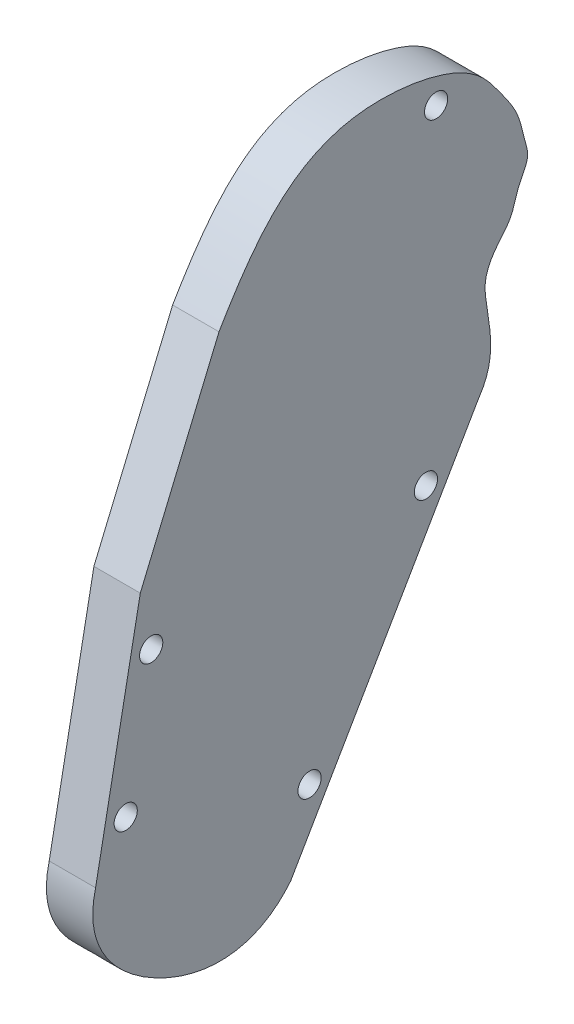
ISO-10303-21;
HEADER;
FILE_DESCRIPTION(('STEP AP214'),'2;1');
FILE_NAME('part.step','',(''),(''),'','','');
FILE_SCHEMA(('AUTOMOTIVE_DESIGN { 1 0 10303 214 1 1 1 1 }'));
ENDSEC;
DATA;
#1=APPLICATION_CONTEXT('core data for automotive mechanical design processes');
#2=APPLICATION_PROTOCOL_DEFINITION('international standard','automotive_design',2000,#1);
#3=PRODUCT_CONTEXT('',#1,'mechanical');
#4=PRODUCT('Part','Part','',(#3));
#5=PRODUCT_RELATED_PRODUCT_CATEGORY('part','',(#4));
#6=PRODUCT_DEFINITION_FORMATION('','',#4);
#7=PRODUCT_DEFINITION_CONTEXT('part definition',#1,'design');
#8=PRODUCT_DEFINITION('design','',#6,#7);
#9=PRODUCT_DEFINITION_SHAPE('','',#8);
#10=(LENGTH_UNIT() NAMED_UNIT(*) SI_UNIT(.MILLI.,.METRE.));
#11=(NAMED_UNIT(*) PLANE_ANGLE_UNIT() SI_UNIT($,.RADIAN.));
#12=(NAMED_UNIT(*) SI_UNIT($,.STERADIAN.) SOLID_ANGLE_UNIT());
#13=UNCERTAINTY_MEASURE_WITH_UNIT(LENGTH_MEASURE(1.E-05),#10,'distance_accuracy_value','');
#14=(GEOMETRIC_REPRESENTATION_CONTEXT(3) GLOBAL_UNCERTAINTY_ASSIGNED_CONTEXT((#13)) GLOBAL_UNIT_ASSIGNED_CONTEXT((#10,
#11,#12)) REPRESENTATION_CONTEXT('',''));
#15=CARTESIAN_POINT('',(0.,0.,0.));
#16=DIRECTION('',(0.,0.,1.));
#17=DIRECTION('',(1.,0.,0.));
#18=AXIS2_PLACEMENT_3D('',#15,#16,#17);
#19=CARTESIAN_POINT('',(-5.,3.24268600938084,-18.5764900303567));
#20=CARTESIAN_POINT('',(-5.,5.87147233760619,-20.3998753405111));
#21=CARTESIAN_POINT('',(-5.,9.3921691085198,-19.6866785835696));
#22=CARTESIAN_POINT('',(-5.,13.8192568790985,-19.0567329112693));
#23=CARTESIAN_POINT('',(-5.,16.2846985090689,-20.2071283244041));
#24=CARTESIAN_POINT('',(-5.,18.154123407449,-22.236157968365));
#25=CARTESIAN_POINT('',(-5.,20.9000774768321,-22.6647365482831));
#26=CARTESIAN_POINT('',(-5.,22.8746123278666,-24.1423851355693));
#27=CARTESIAN_POINT('',(-5.,25.1104176667717,-23.3711660386291));
#28=CARTESIAN_POINT('',(-5.,27.7566189817592,-22.923217745328));
#29=CARTESIAN_POINT('',(-5.,30.3603766268074,-21.0204509876353));
#30=CARTESIAN_POINT('',(-5.,33.0146527615162,-19.1114742427048));
#31=CARTESIAN_POINT('',(-5.,34.5537711996612,-16.8206103843109));
#32=CARTESIAN_POINT('',(-5.,35.7835159213308,-13.5726265314443));
#33=CARTESIAN_POINT('',(-5.,36.5144876853185,-9.24139966209001));
#34=CARTESIAN_POINT('',(-5.,36.2299152608115,-4.11269981578682));
#35=CARTESIAN_POINT('',(-5.,33.0862653845341,3.47885982254407));
#36=CARTESIAN_POINT('',(-5.,27.3181439560148,7.11739920299947));
#37=CARTESIAN_POINT('',(-5.,23.3959085428148,9.43898597361147));
#38=B_SPLINE_CURVE_WITH_KNOTS('',3,(#19,#20,#21,#22,#23,#24,#25,#26,#27,#28,#29,#30,#31,#32,#33,
#34,#35,#36,#37),.UNSPECIFIED.,.F.,.F.,(4,1,1,1,1,1,1,1,1,1,1,1,1,1,1,1,4),(0.,
0.124663564460705,0.161437725204497,0.195659694225229,0.24195670233481,0.280314530276236,
0.317452049066172,0.342380682780381,0.380427051216662,0.438288460536179,0.482854303333472,
0.526779389798994,0.55920608913252,0.638222424046053,0.72183705193685,0.785951737587909,1.),.UNSPECIFIED.);
#39=DIRECTION('',(1.,0.,0.));
#40=VECTOR('',#39,1.);
#41=SURFACE_OF_LINEAR_EXTRUSION('',#38,#40);
#42=CARTESIAN_POINT('',(0.,3.24268600938084,-18.5764900303567));
#43=CARTESIAN_POINT('',(0.,5.87147233760619,-20.3998753405111));
#44=CARTESIAN_POINT('',(0.,9.3921691085198,-19.6866785835696));
#45=CARTESIAN_POINT('',(0.,13.8192568790985,-19.0567329112693));
#46=CARTESIAN_POINT('',(0.,16.2846985090689,-20.2071283244041));
#47=CARTESIAN_POINT('',(0.,18.154123407449,-22.236157968365));
#48=CARTESIAN_POINT('',(0.,20.9000774768321,-22.6647365482831));
#49=CARTESIAN_POINT('',(0.,22.8746123278666,-24.1423851355693));
#50=CARTESIAN_POINT('',(0.,25.1104176667717,-23.3711660386291));
#51=CARTESIAN_POINT('',(0.,27.7566189817592,-22.923217745328));
#52=CARTESIAN_POINT('',(0.,30.3603766268074,-21.0204509876353));
#53=CARTESIAN_POINT('',(0.,33.0146527615162,-19.1114742427048));
#54=CARTESIAN_POINT('',(0.,34.5537711996612,-16.8206103843109));
#55=CARTESIAN_POINT('',(0.,35.7835159213308,-13.5726265314443));
#56=CARTESIAN_POINT('',(0.,36.5144876853185,-9.24139966209001));
#57=CARTESIAN_POINT('',(0.,36.2299152608115,-4.11269981578682));
#58=CARTESIAN_POINT('',(0.,33.0862653845341,3.47885982254407));
#59=CARTESIAN_POINT('',(0.,27.3181439560148,7.11739920299947));
#60=CARTESIAN_POINT('',(0.,23.3959085428148,9.43898597361147));
#61=B_SPLINE_CURVE_WITH_KNOTS('',3,(#42,#43,#44,#45,#46,#47,#48,#49,#50,#51,#52,#53,#54,#55,#56,
#57,#58,#59,#60),.UNSPECIFIED.,.F.,.F.,(4,1,1,1,1,1,1,1,1,1,1,1,1,1,1,1,4),(0.,
0.124663564460705,0.161437725204497,0.195659694225229,0.24195670233481,0.280314530276236,
0.317452049066172,0.342380682780381,0.380427051216662,0.438288460536179,0.482854303333472,
0.526779389798994,0.55920608913252,0.638222424046053,0.72183705193685,0.785951737587909,1.),.UNSPECIFIED.);
#62=CARTESIAN_POINT('',(0.,3.24268600938084,-18.5764900303567));
#63=VERTEX_POINT('',#62);
#64=CARTESIAN_POINT('',(0.,23.3959085428148,9.43898597361147));
#65=VERTEX_POINT('',#64);
#66=EDGE_CURVE('E148',#63,#65,#61,.T.);
#67=ORIENTED_EDGE('',*,*,#66,.F.);
#68=DIRECTION('',(1.,0.,0.));
#69=VECTOR('',#68,1.);
#70=CARTESIAN_POINT('',(-5.,3.24268600938084,-18.5764900303567));
#71=LINE('',#70,#69);
#72=CARTESIAN_POINT('',(-5.,3.24268600938084,-18.5764900303567));
#73=VERTEX_POINT('',#72);
#74=EDGE_CURVE('E11',#73,#63,#71,.T.);
#75=ORIENTED_EDGE('',*,*,#74,.F.);
#76=CARTESIAN_POINT('',(-5.,23.3959085428148,9.43898597361147));
#77=VERTEX_POINT('',#76);
#78=EDGE_CURVE('E117',#73,#77,#38,.T.);
#79=ORIENTED_EDGE('',*,*,#78,.T.);
#80=DIRECTION('',(1.,0.,0.));
#81=VECTOR('',#80,1.);
#82=CARTESIAN_POINT('',(-5.,23.3959085428148,9.43898597361147));
#83=LINE('',#82,#81);
#84=EDGE_CURVE('E87',#77,#65,#83,.T.);
#85=ORIENTED_EDGE('',*,*,#84,.T.);
#86=EDGE_LOOP('',(#67,#75,#79,#85));
#87=FACE_BOUND('',#86,.T.);
#88=ADVANCED_FACE('F38',(#87),#41,.T.);
#89=CARTESIAN_POINT('',(-5.,3.24268600938084,-18.5764900303567));
#90=DIRECTION('',(0.,-0.501767837348837,-0.86500233375539));
#91=DIRECTION('',(0.,0.86500233375539,-0.501767837348837));
#92=AXIS2_PLACEMENT_3D('',#89,#90,#91);
#93=PLANE('',#92);
#94=DIRECTION('',(0.,0.86500233375539,-0.501767837348837));
#95=VECTOR('',#94,1.);
#96=CARTESIAN_POINT('',(0.,3.24268600938084,-18.5764900303567));
#97=LINE('',#96,#95);
#98=CARTESIAN_POINT('',(0.,-31.739081671424,1.71562391069139));
#99=VERTEX_POINT('',#98);
#100=EDGE_CURVE('E155',#99,#63,#97,.T.);
#101=ORIENTED_EDGE('',*,*,#100,.F.);
#102=DIRECTION('',(1.,0.,0.));
#103=VECTOR('',#102,1.);
#104=CARTESIAN_POINT('',(-5.,-31.739081671424,1.71562391069139));
#105=LINE('',#104,#103);
#106=CARTESIAN_POINT('',(-5.,-31.739081671424,1.71562391069139));
#107=VERTEX_POINT('',#106);
#108=EDGE_CURVE('E49',#107,#99,#105,.T.);
#109=ORIENTED_EDGE('',*,*,#108,.F.);
#110=DIRECTION('',(0.,0.86500233375539,-0.501767837348837));
#111=VECTOR('',#110,1.);
#112=CARTESIAN_POINT('',(-5.,3.24268600938084,-18.5764900303567));
#113=LINE('',#112,#111);
#114=EDGE_CURVE('E109',#107,#73,#113,.T.);
#115=ORIENTED_EDGE('',*,*,#114,.T.);
#116=ORIENTED_EDGE('',*,*,#74,.T.);
#117=EDGE_LOOP('',(#101,#109,#115,#116));
#118=FACE_BOUND('',#117,.T.);
#119=ADVANCED_FACE('F131',(#118),#93,.T.);
#120=CARTESIAN_POINT('',(-5.,-21.856113647564,22.7429604930037));
#121=CARTESIAN_POINT('',(-5.,-27.3028345119861,24.1423851355693));
#122=CARTESIAN_POINT('',(-5.,-35.6646516834791,16.6039483783817));
#123=CARTESIAN_POINT('',(-5.,-36.5144876853185,5.5980948755147));
#124=CARTESIAN_POINT('',(-5.,-31.739081671424,1.71562391069139));
#125=B_SPLINE_CURVE_WITH_KNOTS('',3,(#120,#121,#122,#123,#124),.UNSPECIFIED.,.F.,.F.,(4,1,4),
(0.,0.48418997005999,1.),.UNSPECIFIED.);
#126=DIRECTION('',(1.,0.,0.));
#127=VECTOR('',#126,1.);
#128=SURFACE_OF_LINEAR_EXTRUSION('',#125,#127);
#129=CARTESIAN_POINT('',(0.,-21.856113647564,22.7429604930037));
#130=CARTESIAN_POINT('',(0.,-27.3028345119861,24.1423851355693));
#131=CARTESIAN_POINT('',(0.,-35.6646516834791,16.6039483783817));
#132=CARTESIAN_POINT('',(0.,-36.5144876853185,5.5980948755147));
#133=CARTESIAN_POINT('',(0.,-31.739081671424,1.71562391069139));
#134=B_SPLINE_CURVE_WITH_KNOTS('',3,(#129,#130,#131,#132,#133),.UNSPECIFIED.,.F.,.F.,(4,1,4),
(0.,0.48418997005999,1.),.UNSPECIFIED.);
#135=CARTESIAN_POINT('',(0.,-21.856113647564,22.7429604930037));
#136=VERTEX_POINT('',#135);
#137=EDGE_CURVE('E97',#136,#99,#134,.T.);
#138=ORIENTED_EDGE('',*,*,#137,.F.);
#139=DIRECTION('',(1.,0.,0.));
#140=VECTOR('',#139,1.);
#141=CARTESIAN_POINT('',(-5.,-21.856113647564,22.7429604930037));
#142=LINE('',#141,#140);
#143=CARTESIAN_POINT('',(-5.,-21.856113647564,22.7429604930037));
#144=VERTEX_POINT('',#143);
#145=EDGE_CURVE('E92',#144,#136,#142,.T.);
#146=ORIENTED_EDGE('',*,*,#145,.F.);
#147=EDGE_CURVE('E95',#144,#107,#125,.T.);
#148=ORIENTED_EDGE('',*,*,#147,.T.);
#149=ORIENTED_EDGE('',*,*,#108,.T.);
#150=EDGE_LOOP('',(#138,#146,#148,#149));
#151=FACE_BOUND('',#150,.T.);
#152=ADVANCED_FACE('F94',(#151),#128,.T.);
#153=CARTESIAN_POINT('',(-5.,-21.856113647564,22.7429604930037));
#154=DIRECTION('',(0.,0.188598031806165,0.982054368351794));
#155=DIRECTION('',(0.,-0.982054368351794,0.188598031806165));
#156=AXIS2_PLACEMENT_3D('',#153,#154,#155);
#157=PLANE('',#156);
#158=DIRECTION('',(0.,-0.982054368351794,0.188598031806165));
#159=VECTOR('',#158,1.);
#160=CARTESIAN_POINT('',(0.,-21.856113647564,22.7429604930037));
#161=LINE('',#160,#159);
#162=CARTESIAN_POINT('',(0.,3.24268600938089,17.9228768310965));
#163=VERTEX_POINT('',#162);
#164=EDGE_CURVE('E160',#163,#136,#161,.T.);
#165=ORIENTED_EDGE('',*,*,#164,.F.);
#166=DIRECTION('',(1.,0.,0.));
#167=VECTOR('',#166,1.);
#168=CARTESIAN_POINT('',(-5.,3.24268600938089,17.9228768310965));
#169=LINE('',#168,#167);
#170=CARTESIAN_POINT('',(-5.,3.24268600938089,17.9228768310965));
#171=VERTEX_POINT('',#170);
#172=EDGE_CURVE('E103',#171,#163,#169,.T.);
#173=ORIENTED_EDGE('',*,*,#172,.F.);
#174=DIRECTION('',(0.,-0.982054368351794,0.188598031806165));
#175=VECTOR('',#174,1.);
#176=CARTESIAN_POINT('',(-5.,-21.856113647564,22.7429604930037));
#177=LINE('',#176,#175);
#178=EDGE_CURVE('E108',#171,#144,#177,.T.);
#179=ORIENTED_EDGE('',*,*,#178,.T.);
#180=ORIENTED_EDGE('',*,*,#145,.T.);
#181=EDGE_LOOP('',(#165,#173,#179,#180));
#182=FACE_BOUND('',#181,.T.);
#183=ADVANCED_FACE('F112',(#182),#157,.T.);
#184=CARTESIAN_POINT('',(-5.,3.24268600938089,17.9228768310965));
#185=DIRECTION('',(0.,0.387991872870305,0.921662794402917));
#186=DIRECTION('',(0.,-0.921662794402917,0.387991872870305));
#187=AXIS2_PLACEMENT_3D('',#184,#185,#186);
#188=PLANE('',#187);
#189=DIRECTION('',(0.,-0.921662794402917,0.387991872870305));
#190=VECTOR('',#189,1.);
#191=CARTESIAN_POINT('',(0.,3.24268600938089,17.9228768310965));
#192=LINE('',#191,#190);
#193=EDGE_CURVE('E153',#65,#163,#192,.T.);
#194=ORIENTED_EDGE('',*,*,#193,.F.);
#195=ORIENTED_EDGE('',*,*,#84,.F.);
#196=DIRECTION('',(0.,-0.921662794402917,0.387991872870305));
#197=VECTOR('',#196,1.);
#198=CARTESIAN_POINT('',(-5.,3.24268600938089,17.9228768310965));
#199=LINE('',#198,#197);
#200=EDGE_CURVE('E114',#77,#171,#199,.T.);
#201=ORIENTED_EDGE('',*,*,#200,.T.);
#202=ORIENTED_EDGE('',*,*,#172,.T.);
#203=EDGE_LOOP('',(#194,#195,#201,#202));
#204=FACE_BOUND('',#203,.T.);
#205=ADVANCED_FACE('F134',(#204),#188,.T.);
#206=CARTESIAN_POINT('',(-5.,33.6435818831973,-18.0927204875211));
#207=DIRECTION('',(-1.,0.,0.));
#208=DIRECTION('',(0.,0.,1.));
#209=AXIS2_PLACEMENT_3D('',#206,#207,#208);
#210=PLANE('',#209);
#211=CARTESIAN_POINT('',(-5.,32.8295709845023,-13.9632215639872));
#212=DIRECTION('',(-1.,0.,0.));
#213=DIRECTION('',(0.,0.,1.));
#214=AXIS2_PLACEMENT_3D('',#211,#212,#213);
#215=CIRCLE('',#214,1.25);
#216=CARTESIAN_POINT('',(-5.,32.8295709845023,-12.7132215639872));
#217=VERTEX_POINT('',#216);
#218=EDGE_CURVE('E154',#217,#217,#215,.T.);
#219=ORIENTED_EDGE('',*,*,#218,.F.);
#220=EDGE_LOOP('',(#219));
#221=FACE_BOUND('',#220,.T.);
#222=CARTESIAN_POINT('',(-5.,-2.11585385974969,-12.8669759992907));
#223=DIRECTION('',(-1.,0.,0.));
#224=DIRECTION('',(0.,0.,1.));
#225=AXIS2_PLACEMENT_3D('',#222,#223,#224);
#226=CIRCLE('',#225,1.25);
#227=CARTESIAN_POINT('',(-5.,-2.11585385974969,-11.6169759992907));
#228=VERTEX_POINT('',#227);
#229=EDGE_CURVE('E189',#228,#228,#226,.T.);
#230=ORIENTED_EDGE('',*,*,#229,.F.);
#231=EDGE_LOOP('',(#230));
#232=FACE_BOUND('',#231,.T.);
#233=CARTESIAN_POINT('',(-5.,-23.7409122036345,-0.322780065569843));
#234=DIRECTION('',(-1.,0.,0.));
#235=DIRECTION('',(0.,0.,1.));
#236=AXIS2_PLACEMENT_3D('',#233,#234,#235);
#237=CIRCLE('',#236,1.25);
#238=CARTESIAN_POINT('',(-5.,-23.7409122036345,0.927219934430157));
#239=VERTEX_POINT('',#238);
#240=EDGE_CURVE('E185',#239,#239,#237,.T.);
#241=ORIENTED_EDGE('',*,*,#240,.F.);
#242=EDGE_LOOP('',(#241));
#243=FACE_BOUND('',#242,.T.);
#244=CARTESIAN_POINT('',(-5.,-16.879160193193,19.4960489892783));
#245=DIRECTION('',(-1.,0.,0.));
#246=DIRECTION('',(0.,0.,1.));
#247=AXIS2_PLACEMENT_3D('',#244,#245,#246);
#248=CIRCLE('',#247,1.25);
#249=CARTESIAN_POINT('',(-5.,-16.879160193193,20.7460489892783));
#250=VERTEX_POINT('',#249);
#251=EDGE_CURVE('E181',#250,#250,#248,.T.);
#252=ORIENTED_EDGE('',*,*,#251,.F.);
#253=EDGE_LOOP('',(#252));
#254=FACE_BOUND('',#253,.T.);
#255=CARTESIAN_POINT('',(-5.,-2.58295858811781,16.750543677239));
#256=DIRECTION('',(-1.,0.,0.));
#257=DIRECTION('',(0.,0.,1.));
#258=AXIS2_PLACEMENT_3D('',#255,#256,#257);
#259=CIRCLE('',#258,1.25);
#260=CARTESIAN_POINT('',(-5.,-2.58295858811781,18.000543677239));
#261=VERTEX_POINT('',#260);
#262=EDGE_CURVE('E176',#261,#261,#259,.T.);
#263=ORIENTED_EDGE('',*,*,#262,.F.);
#264=EDGE_LOOP('',(#263));
#265=FACE_BOUND('',#264,.T.);
#266=ORIENTED_EDGE('',*,*,#78,.F.);
#267=ORIENTED_EDGE('',*,*,#114,.F.);
#268=ORIENTED_EDGE('',*,*,#147,.F.);
#269=ORIENTED_EDGE('',*,*,#178,.F.);
#270=ORIENTED_EDGE('',*,*,#200,.F.);
#271=EDGE_LOOP('',(#266,#267,#268,#269,#270));
#272=FACE_BOUND('',#271,.T.);
#273=ADVANCED_FACE('F107',(#221,#232,#243,#254,#265,#272),#210,.T.);
#274=CARTESIAN_POINT('',(0.,33.6435818831973,-18.0927204875211));
#275=DIRECTION('',(-1.,0.,0.));
#276=DIRECTION('',(0.,0.,1.));
#277=AXIS2_PLACEMENT_3D('',#274,#275,#276);
#278=PLANE('',#277);
#279=CARTESIAN_POINT('',(0.,32.8295709845023,-13.9632215639872));
#280=DIRECTION('',(-1.,0.,0.));
#281=DIRECTION('',(0.,0.,1.));
#282=AXIS2_PLACEMENT_3D('',#279,#280,#281);
#283=CIRCLE('',#282,1.25);
#284=CARTESIAN_POINT('',(0.,32.8295709845023,-12.7132215639872));
#285=VERTEX_POINT('',#284);
#286=EDGE_CURVE('E42',#285,#285,#283,.T.);
#287=ORIENTED_EDGE('',*,*,#286,.T.);
#288=EDGE_LOOP('',(#287));
#289=FACE_BOUND('',#288,.T.);
#290=CARTESIAN_POINT('',(0.,-2.11585385974969,-12.8669759992907));
#291=DIRECTION('',(-1.,0.,0.));
#292=DIRECTION('',(0.,0.,1.));
#293=AXIS2_PLACEMENT_3D('',#290,#291,#292);
#294=CIRCLE('',#293,1.25);
#295=CARTESIAN_POINT('',(0.,-2.11585385974969,-11.6169759992907));
#296=VERTEX_POINT('',#295);
#297=EDGE_CURVE('E186',#296,#296,#294,.T.);
#298=ORIENTED_EDGE('',*,*,#297,.T.);
#299=EDGE_LOOP('',(#298));
#300=FACE_BOUND('',#299,.T.);
#301=CARTESIAN_POINT('',(0.,-23.7409122036345,-0.322780065569843));
#302=DIRECTION('',(-1.,0.,0.));
#303=DIRECTION('',(0.,0.,1.));
#304=AXIS2_PLACEMENT_3D('',#301,#302,#303);
#305=CIRCLE('',#304,1.25);
#306=CARTESIAN_POINT('',(0.,-23.7409122036345,0.927219934430157));
#307=VERTEX_POINT('',#306);
#308=EDGE_CURVE('E182',#307,#307,#305,.T.);
#309=ORIENTED_EDGE('',*,*,#308,.T.);
#310=EDGE_LOOP('',(#309));
#311=FACE_BOUND('',#310,.T.);
#312=CARTESIAN_POINT('',(0.,-16.879160193193,19.4960489892783));
#313=DIRECTION('',(-1.,0.,0.));
#314=DIRECTION('',(0.,0.,1.));
#315=AXIS2_PLACEMENT_3D('',#312,#313,#314);
#316=CIRCLE('',#315,1.25);
#317=CARTESIAN_POINT('',(0.,-16.879160193193,20.7460489892783));
#318=VERTEX_POINT('',#317);
#319=EDGE_CURVE('E177',#318,#318,#316,.T.);
#320=ORIENTED_EDGE('',*,*,#319,.T.);
#321=EDGE_LOOP('',(#320));
#322=FACE_BOUND('',#321,.T.);
#323=CARTESIAN_POINT('',(0.,-2.58295858811781,16.750543677239));
#324=DIRECTION('',(-1.,0.,0.));
#325=DIRECTION('',(0.,0.,1.));
#326=AXIS2_PLACEMENT_3D('',#323,#324,#325);
#327=CIRCLE('',#326,1.25);
#328=CARTESIAN_POINT('',(0.,-2.58295858811781,18.000543677239));
#329=VERTEX_POINT('',#328);
#330=EDGE_CURVE('E172',#329,#329,#327,.T.);
#331=ORIENTED_EDGE('',*,*,#330,.T.);
#332=EDGE_LOOP('',(#331));
#333=FACE_BOUND('',#332,.T.);
#334=ORIENTED_EDGE('',*,*,#66,.T.);
#335=ORIENTED_EDGE('',*,*,#193,.T.);
#336=ORIENTED_EDGE('',*,*,#164,.T.);
#337=ORIENTED_EDGE('',*,*,#137,.T.);
#338=ORIENTED_EDGE('',*,*,#100,.T.);
#339=EDGE_LOOP('',(#334,#335,#336,#337,#338));
#340=FACE_BOUND('',#339,.T.);
#341=ADVANCED_FACE('F140',(#289,#300,#311,#322,#333,#340),#278,.F.);
#342=CARTESIAN_POINT('',(-47.0000000000001,-2.58295858811781,16.750543677239));
#343=DIRECTION('',(1.,0.,0.));
#344=DIRECTION('',(0.,0.,-1.));
#345=AXIS2_PLACEMENT_3D('',#342,#343,#344);
#346=CYLINDRICAL_SURFACE('',#345,1.25);
#347=ORIENTED_EDGE('',*,*,#262,.T.);
#348=EDGE_LOOP('',(#347));
#349=FACE_BOUND('',#348,.T.);
#350=ORIENTED_EDGE('',*,*,#330,.F.);
#351=EDGE_LOOP('',(#350));
#352=FACE_BOUND('',#351,.T.);
#353=ADVANCED_FACE('F230',(#349,#352),#346,.F.);
#354=CARTESIAN_POINT('',(-47.0000000000001,-16.879160193193,19.4960489892783));
#355=DIRECTION('',(1.,0.,0.));
#356=DIRECTION('',(0.,0.,-1.));
#357=AXIS2_PLACEMENT_3D('',#354,#355,#356);
#358=CYLINDRICAL_SURFACE('',#357,1.25);
#359=ORIENTED_EDGE('',*,*,#251,.T.);
#360=EDGE_LOOP('',(#359));
#361=FACE_BOUND('',#360,.T.);
#362=ORIENTED_EDGE('',*,*,#319,.F.);
#363=EDGE_LOOP('',(#362));
#364=FACE_BOUND('',#363,.T.);
#365=ADVANCED_FACE('F232',(#361,#364),#358,.F.);
#366=CARTESIAN_POINT('',(-47.0000000000001,-23.7409122036345,-0.322780065569843));
#367=DIRECTION('',(1.,0.,0.));
#368=DIRECTION('',(0.,0.,-1.));
#369=AXIS2_PLACEMENT_3D('',#366,#367,#368);
#370=CYLINDRICAL_SURFACE('',#369,1.25);
#371=ORIENTED_EDGE('',*,*,#240,.T.);
#372=EDGE_LOOP('',(#371));
#373=FACE_BOUND('',#372,.T.);
#374=ORIENTED_EDGE('',*,*,#308,.F.);
#375=EDGE_LOOP('',(#374));
#376=FACE_BOUND('',#375,.T.);
#377=ADVANCED_FACE('F225',(#373,#376),#370,.F.);
#378=CARTESIAN_POINT('',(-47.0000000000001,-2.11585385974969,-12.8669759992907));
#379=DIRECTION('',(1.,0.,0.));
#380=DIRECTION('',(0.,0.,-1.));
#381=AXIS2_PLACEMENT_3D('',#378,#379,#380);
#382=CYLINDRICAL_SURFACE('',#381,1.25);
#383=ORIENTED_EDGE('',*,*,#229,.T.);
#384=EDGE_LOOP('',(#383));
#385=FACE_BOUND('',#384,.T.);
#386=ORIENTED_EDGE('',*,*,#297,.F.);
#387=EDGE_LOOP('',(#386));
#388=FACE_BOUND('',#387,.T.);
#389=ADVANCED_FACE('F220',(#385,#388),#382,.F.);
#390=CARTESIAN_POINT('',(-47.0000000000001,32.8295709845023,-13.9632215639872));
#391=DIRECTION('',(1.,0.,0.));
#392=DIRECTION('',(0.,0.,-1.));
#393=AXIS2_PLACEMENT_3D('',#390,#391,#392);
#394=CYLINDRICAL_SURFACE('',#393,1.25);
#395=ORIENTED_EDGE('',*,*,#218,.T.);
#396=EDGE_LOOP('',(#395));
#397=FACE_BOUND('',#396,.T.);
#398=ORIENTED_EDGE('',*,*,#286,.F.);
#399=EDGE_LOOP('',(#398));
#400=FACE_BOUND('',#399,.T.);
#401=ADVANCED_FACE('F218',(#397,#400),#394,.F.);
#402=CLOSED_SHELL('',(#88,#119,#152,#183,#205,#273,#341,#353,#365,#377,#389,#401));
#403=MANIFOLD_SOLID_BREP('B2',#402);
#404=ADVANCED_BREP_SHAPE_REPRESENTATION('',(#18,#403),#14);
#405=SHAPE_DEFINITION_REPRESENTATION(#9,#404);
ENDSEC;
END-ISO-10303-21;
